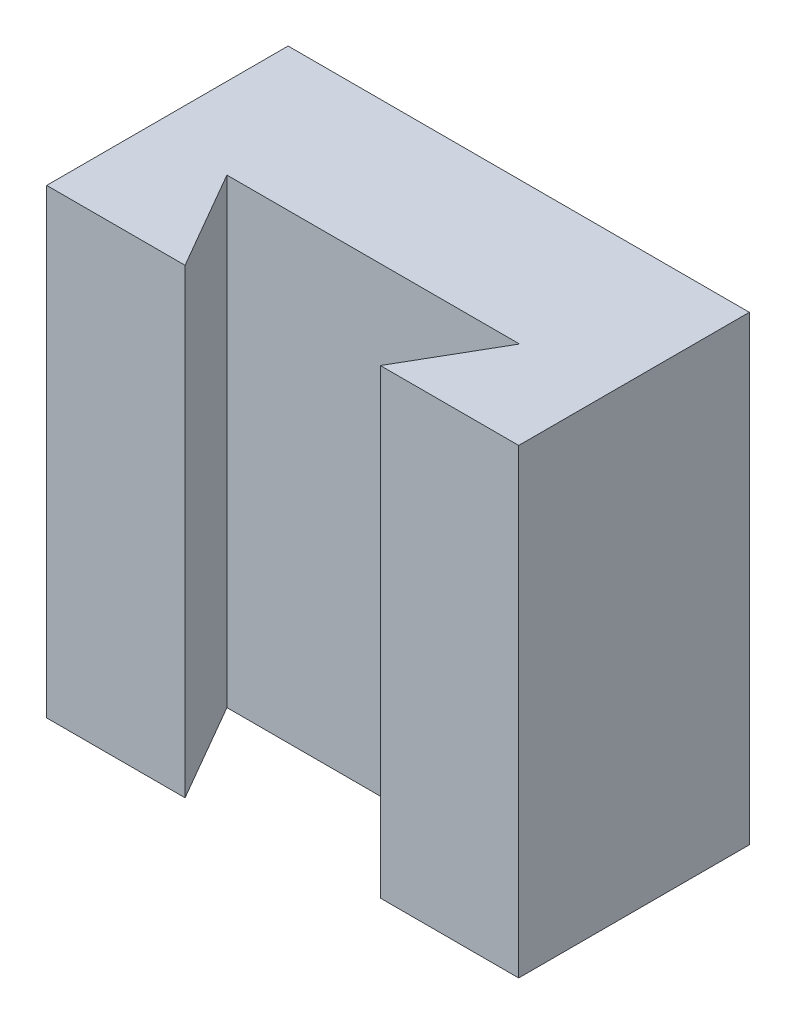
ISO-10303-21;
HEADER;
FILE_DESCRIPTION(('STEP AP214'),'2;1');
FILE_NAME('part.step','',(''),(''),'','','');
FILE_SCHEMA(('AUTOMOTIVE_DESIGN { 1 0 10303 214 1 1 1 1 }'));
ENDSEC;
DATA;
#1=APPLICATION_CONTEXT('core data for automotive mechanical design processes');
#2=APPLICATION_PROTOCOL_DEFINITION('international standard','automotive_design',2000,#1);
#3=PRODUCT_CONTEXT('',#1,'mechanical');
#4=PRODUCT('Part','Part','',(#3));
#5=PRODUCT_RELATED_PRODUCT_CATEGORY('part','',(#4));
#6=PRODUCT_DEFINITION_FORMATION('','',#4);
#7=PRODUCT_DEFINITION_CONTEXT('part definition',#1,'design');
#8=PRODUCT_DEFINITION('design','',#6,#7);
#9=PRODUCT_DEFINITION_SHAPE('','',#8);
#10=(LENGTH_UNIT() NAMED_UNIT(*) SI_UNIT(.MILLI.,.METRE.));
#11=(NAMED_UNIT(*) PLANE_ANGLE_UNIT() SI_UNIT($,.RADIAN.));
#12=(NAMED_UNIT(*) SI_UNIT($,.STERADIAN.) SOLID_ANGLE_UNIT());
#13=UNCERTAINTY_MEASURE_WITH_UNIT(LENGTH_MEASURE(1.E-05),#10,'distance_accuracy_value','');
#14=(GEOMETRIC_REPRESENTATION_CONTEXT(3) GLOBAL_UNCERTAINTY_ASSIGNED_CONTEXT((#13)) GLOBAL_UNIT_ASSIGNED_CONTEXT((#10,
#11,#12)) REPRESENTATION_CONTEXT('',''));
#15=CARTESIAN_POINT('',(0.,0.,0.));
#16=DIRECTION('',(0.,0.,1.));
#17=DIRECTION('',(1.,0.,0.));
#18=AXIS2_PLACEMENT_3D('',#15,#16,#17);
#19=CARTESIAN_POINT('',(-5.,-0.00999999999999959,0.234054964457145));
#20=DIRECTION('',(0.,0.,-1.));
#21=DIRECTION('',(-1.,0.,0.));
#22=AXIS2_PLACEMENT_3D('',#19,#20,#21);
#23=PLANE('',#22);
#24=DIRECTION('',(0.,1.,0.));
#25=VECTOR('',#24,1.);
#26=CARTESIAN_POINT('',(-2.,-0.00999999999999959,0.234054964457145));
#27=LINE('',#26,#25);
#28=CARTESIAN_POINT('',(-2.,0.,0.234054964457145));
#29=VERTEX_POINT('',#28);
#30=CARTESIAN_POINT('',(-2.,10.,0.234054964457145));
#31=VERTEX_POINT('',#30);
#32=EDGE_CURVE('E11',#29,#31,#27,.T.);
#33=ORIENTED_EDGE('',*,*,#32,.T.);
#34=DIRECTION('',(-1.,0.,0.));
#35=VECTOR('',#34,1.);
#36=CARTESIAN_POINT('',(0.,10.,0.234054964457145));
#37=LINE('',#36,#35);
#38=CARTESIAN_POINT('',(-5.,10.,0.234054964457145));
#39=VERTEX_POINT('',#38);
#40=EDGE_CURVE('E150',#31,#39,#37,.T.);
#41=ORIENTED_EDGE('',*,*,#40,.T.);
#42=DIRECTION('',(0.,1.,0.));
#43=VECTOR('',#42,1.);
#44=CARTESIAN_POINT('',(-5.,10.,0.234054964457145));
#45=LINE('',#44,#43);
#46=CARTESIAN_POINT('',(-5.,0.,0.234054964457145));
#47=VERTEX_POINT('',#46);
#48=EDGE_CURVE('E149',#47,#39,#45,.T.);
#49=ORIENTED_EDGE('',*,*,#48,.F.);
#50=DIRECTION('',(-1.,0.,0.));
#51=VECTOR('',#50,1.);
#52=CARTESIAN_POINT('',(0.,0.,0.234054964457145));
#53=LINE('',#52,#51);
#54=EDGE_CURVE('E57',#29,#47,#53,.T.);
#55=ORIENTED_EDGE('',*,*,#54,.F.);
#56=EDGE_LOOP('',(#33,#41,#49,#55));
#57=FACE_BOUND('',#56,.T.);
#58=ADVANCED_FACE('F43',(#57),#23,.F.);
#59=CARTESIAN_POINT('',(-2.,-0.00999999999999959,0.234054964457145));
#60=DIRECTION('',(-0.866025403784436,0.,0.500000000000004));
#61=DIRECTION('',(0.500000000000004,0.,0.866025403784436));
#62=AXIS2_PLACEMENT_3D('',#59,#60,#61);
#63=PLANE('',#62);
#64=DIRECTION('',(0.,1.,0.));
#65=VECTOR('',#64,1.);
#66=CARTESIAN_POINT('',(-3.2399584674678,-0.00999999999999959,-1.9136161004723));
#67=LINE('',#66,#65);
#68=CARTESIAN_POINT('',(-3.2399584674678,0.,-1.9136161004723));
#69=VERTEX_POINT('',#68);
#70=CARTESIAN_POINT('',(-3.2399584674678,10.,-1.9136161004723));
#71=VERTEX_POINT('',#70);
#72=EDGE_CURVE('E51',#69,#71,#67,.T.);
#73=ORIENTED_EDGE('',*,*,#72,.T.);
#74=DIRECTION('',(0.500000000000004,0.,0.866025403784436));
#75=VECTOR('',#74,1.);
#76=CARTESIAN_POINT('',(-1.60134877255087,10.,0.924539144898731));
#77=LINE('',#76,#75);
#78=EDGE_CURVE('E154',#71,#31,#77,.T.);
#79=ORIENTED_EDGE('',*,*,#78,.T.);
#80=ORIENTED_EDGE('',*,*,#32,.F.);
#81=DIRECTION('',(0.500000000000004,0.,0.866025403784436));
#82=VECTOR('',#81,1.);
#83=CARTESIAN_POINT('',(-1.60134877255087,0.,0.924539144898731));
#84=LINE('',#83,#82);
#85=EDGE_CURVE('E64',#69,#29,#84,.T.);
#86=ORIENTED_EDGE('',*,*,#85,.F.);
#87=EDGE_LOOP('',(#73,#79,#80,#86));
#88=FACE_BOUND('',#87,.T.);
#89=ADVANCED_FACE('F172',(#88),#63,.F.);
#90=CARTESIAN_POINT('',(-3.2399584674678,-0.00999999999999959,-1.9136161004723));
#91=DIRECTION('',(0.,0.,-1.));
#92=DIRECTION('',(-1.,0.,0.));
#93=AXIS2_PLACEMENT_3D('',#90,#91,#92);
#94=PLANE('',#93);
#95=DIRECTION('',(0.,1.,0.));
#96=VECTOR('',#95,1.);
#97=CARTESIAN_POINT('',(3.1048267707333,-0.00999999999999959,-1.9136161004723));
#98=LINE('',#97,#96);
#99=CARTESIAN_POINT('',(3.1048267707333,0.,-1.9136161004723));
#100=VERTEX_POINT('',#99);
#101=CARTESIAN_POINT('',(3.1048267707333,10.,-1.9136161004723));
#102=VERTEX_POINT('',#101);
#103=EDGE_CURVE('E169',#100,#102,#98,.T.);
#104=ORIENTED_EDGE('',*,*,#103,.T.);
#105=DIRECTION('',(-1.,0.,0.));
#106=VECTOR('',#105,1.);
#107=CARTESIAN_POINT('',(0.,10.,-1.9136161004723));
#108=LINE('',#107,#106);
#109=EDGE_CURVE('E157',#102,#71,#108,.T.);
#110=ORIENTED_EDGE('',*,*,#109,.T.);
#111=ORIENTED_EDGE('',*,*,#72,.F.);
#112=DIRECTION('',(-1.,0.,0.));
#113=VECTOR('',#112,1.);
#114=CARTESIAN_POINT('',(0.,0.,-1.9136161004723));
#115=LINE('',#114,#113);
#116=EDGE_CURVE('E141',#100,#69,#115,.T.);
#117=ORIENTED_EDGE('',*,*,#116,.F.);
#118=EDGE_LOOP('',(#104,#110,#111,#117));
#119=FACE_BOUND('',#118,.T.);
#120=ADVANCED_FACE('F174',(#119),#94,.F.);
#121=CARTESIAN_POINT('',(3.1048267707333,-0.00999999999999959,-1.9136161004723));
#122=DIRECTION('',(0.866025403784436,0.,0.500000000000004));
#123=DIRECTION('',(0.500000000000004,0.,-0.866025403784436));
#124=AXIS2_PLACEMENT_3D('',#121,#122,#123);
#125=PLANE('',#124);
#126=DIRECTION('',(0.,1.,0.));
#127=VECTOR('',#126,1.);
#128=CARTESIAN_POINT('',(2.,-0.00999999999999959,0.));
#129=LINE('',#128,#127);
#130=CARTESIAN_POINT('',(2.,0.,0.));
#131=VERTEX_POINT('',#130);
#132=CARTESIAN_POINT('',(2.,10.,0.));
#133=VERTEX_POINT('',#132);
#134=EDGE_CURVE('E153',#131,#133,#129,.T.);
#135=ORIENTED_EDGE('',*,*,#134,.T.);
#136=DIRECTION('',(0.500000000000004,0.,-0.866025403784436));
#137=VECTOR('',#136,1.);
#138=CARTESIAN_POINT('',(1.49999999999999,10.,0.866025403784443));
#139=LINE('',#138,#137);
#140=EDGE_CURVE('E160',#133,#102,#139,.T.);
#141=ORIENTED_EDGE('',*,*,#140,.T.);
#142=ORIENTED_EDGE('',*,*,#103,.F.);
#143=DIRECTION('',(0.500000000000004,0.,-0.866025403784436));
#144=VECTOR('',#143,1.);
#145=CARTESIAN_POINT('',(1.49999999999999,0.,0.866025403784443));
#146=LINE('',#145,#144);
#147=EDGE_CURVE('E143',#131,#100,#146,.T.);
#148=ORIENTED_EDGE('',*,*,#147,.F.);
#149=EDGE_LOOP('',(#135,#141,#142,#148));
#150=FACE_BOUND('',#149,.T.);
#151=ADVANCED_FACE('F187',(#150),#125,.F.);
#152=CARTESIAN_POINT('',(2.,-0.00999999999999959,0.));
#153=DIRECTION('',(0.,0.,-1.));
#154=DIRECTION('',(-1.,0.,0.));
#155=AXIS2_PLACEMENT_3D('',#152,#153,#154);
#156=PLANE('',#155);
#157=DIRECTION('',(0.,-1.,0.));
#158=VECTOR('',#157,1.);
#159=CARTESIAN_POINT('',(5.,10.,0.));
#160=LINE('',#159,#158);
#161=CARTESIAN_POINT('',(5.,10.,0.));
#162=VERTEX_POINT('',#161);
#163=CARTESIAN_POINT('',(5.,0.,0.));
#164=VERTEX_POINT('',#163);
#165=EDGE_CURVE('E164',#162,#164,#160,.T.);
#166=ORIENTED_EDGE('',*,*,#165,.F.);
#167=DIRECTION('',(-1.,0.,0.));
#168=VECTOR('',#167,1.);
#169=CARTESIAN_POINT('',(0.,10.,0.));
#170=LINE('',#169,#168);
#171=EDGE_CURVE('E115',#162,#133,#170,.T.);
#172=ORIENTED_EDGE('',*,*,#171,.T.);
#173=ORIENTED_EDGE('',*,*,#134,.F.);
#174=DIRECTION('',(-1.,0.,0.));
#175=VECTOR('',#174,1.);
#176=CARTESIAN_POINT('',(0.,0.,0.));
#177=LINE('',#176,#175);
#178=EDGE_CURVE('E146',#164,#131,#177,.T.);
#179=ORIENTED_EDGE('',*,*,#178,.F.);
#180=EDGE_LOOP('',(#166,#172,#173,#179));
#181=FACE_BOUND('',#180,.T.);
#182=ADVANCED_FACE('F45',(#181),#156,.F.);
#183=CARTESIAN_POINT('',(-5.,10.,-5.));
#184=DIRECTION('',(0.,0.,1.));
#185=DIRECTION('',(1.,0.,0.));
#186=AXIS2_PLACEMENT_3D('',#183,#184,#185);
#187=PLANE('',#186);
#188=DIRECTION('',(-1.,0.,0.));
#189=VECTOR('',#188,1.);
#190=CARTESIAN_POINT('',(-5.,0.,-5.));
#191=LINE('',#190,#189);
#192=CARTESIAN_POINT('',(5.,0.,-5.));
#193=VERTEX_POINT('',#192);
#194=CARTESIAN_POINT('',(-5.,0.,-5.));
#195=VERTEX_POINT('',#194);
#196=EDGE_CURVE('E198',#193,#195,#191,.T.);
#197=ORIENTED_EDGE('',*,*,#196,.T.);
#198=DIRECTION('',(0.,-1.,0.));
#199=VECTOR('',#198,1.);
#200=CARTESIAN_POINT('',(-5.,10.,-5.));
#201=LINE('',#200,#199);
#202=CARTESIAN_POINT('',(-5.,10.,-5.));
#203=VERTEX_POINT('',#202);
#204=EDGE_CURVE('E127',#203,#195,#201,.T.);
#205=ORIENTED_EDGE('',*,*,#204,.F.);
#206=DIRECTION('',(-1.,0.,0.));
#207=VECTOR('',#206,1.);
#208=CARTESIAN_POINT('',(-5.,10.,-5.));
#209=LINE('',#208,#207);
#210=CARTESIAN_POINT('',(5.,10.,-5.));
#211=VERTEX_POINT('',#210);
#212=EDGE_CURVE('E112',#211,#203,#209,.T.);
#213=ORIENTED_EDGE('',*,*,#212,.F.);
#214=DIRECTION('',(0.,-1.,0.));
#215=VECTOR('',#214,1.);
#216=CARTESIAN_POINT('',(5.,10.,-5.));
#217=LINE('',#216,#215);
#218=EDGE_CURVE('E125',#211,#193,#217,.T.);
#219=ORIENTED_EDGE('',*,*,#218,.T.);
#220=EDGE_LOOP('',(#197,#205,#213,#219));
#221=FACE_BOUND('',#220,.T.);
#222=ADVANCED_FACE('F124',(#221),#187,.F.);
#223=CARTESIAN_POINT('',(-5.,10.,-5.));
#224=DIRECTION('',(1.,0.,0.));
#225=DIRECTION('',(0.,0.,-1.));
#226=AXIS2_PLACEMENT_3D('',#223,#224,#225);
#227=PLANE('',#226);
#228=DIRECTION('',(0.,0.,1.));
#229=VECTOR('',#228,1.);
#230=CARTESIAN_POINT('',(-5.,0.,-5.));
#231=LINE('',#230,#229);
#232=EDGE_CURVE('E120',#195,#47,#231,.T.);
#233=ORIENTED_EDGE('',*,*,#232,.T.);
#234=ORIENTED_EDGE('',*,*,#48,.T.);
#235=DIRECTION('',(0.,0.,1.));
#236=VECTOR('',#235,1.);
#237=CARTESIAN_POINT('',(-5.,10.,-5.));
#238=LINE('',#237,#236);
#239=EDGE_CURVE('E129',#203,#39,#238,.T.);
#240=ORIENTED_EDGE('',*,*,#239,.F.);
#241=ORIENTED_EDGE('',*,*,#204,.T.);
#242=EDGE_LOOP('',(#233,#234,#240,#241));
#243=FACE_BOUND('',#242,.T.);
#244=ADVANCED_FACE('F204',(#243),#227,.F.);
#245=CARTESIAN_POINT('',(5.,10.,-5.));
#246=DIRECTION('',(-1.,0.,0.));
#247=DIRECTION('',(0.,0.,1.));
#248=AXIS2_PLACEMENT_3D('',#245,#246,#247);
#249=PLANE('',#248);
#250=DIRECTION('',(0.,0.,-1.));
#251=VECTOR('',#250,1.);
#252=CARTESIAN_POINT('',(5.,10.,-5.));
#253=LINE('',#252,#251);
#254=EDGE_CURVE('E108',#162,#211,#253,.T.);
#255=ORIENTED_EDGE('',*,*,#254,.F.);
#256=ORIENTED_EDGE('',*,*,#165,.T.);
#257=DIRECTION('',(0.,0.,-1.));
#258=VECTOR('',#257,1.);
#259=CARTESIAN_POINT('',(5.,0.,-5.));
#260=LINE('',#259,#258);
#261=EDGE_CURVE('E133',#164,#193,#260,.T.);
#262=ORIENTED_EDGE('',*,*,#261,.T.);
#263=ORIENTED_EDGE('',*,*,#218,.F.);
#264=EDGE_LOOP('',(#255,#256,#262,#263));
#265=FACE_BOUND('',#264,.T.);
#266=ADVANCED_FACE('F131',(#265),#249,.F.);
#267=CARTESIAN_POINT('',(0.,0.,0.));
#268=DIRECTION('',(0.,1.,0.));
#269=DIRECTION('',(0.,0.,1.));
#270=AXIS2_PLACEMENT_3D('',#267,#268,#269);
#271=PLANE('',#270);
#272=ORIENTED_EDGE('',*,*,#261,.F.);
#273=ORIENTED_EDGE('',*,*,#178,.T.);
#274=ORIENTED_EDGE('',*,*,#147,.T.);
#275=ORIENTED_EDGE('',*,*,#116,.T.);
#276=ORIENTED_EDGE('',*,*,#85,.T.);
#277=ORIENTED_EDGE('',*,*,#54,.T.);
#278=ORIENTED_EDGE('',*,*,#232,.F.);
#279=ORIENTED_EDGE('',*,*,#196,.F.);
#280=EDGE_LOOP('',(#272,#273,#274,#275,#276,#277,#278,#279));
#281=FACE_BOUND('',#280,.T.);
#282=ADVANCED_FACE('F196',(#281),#271,.F.);
#283=CARTESIAN_POINT('',(0.,10.,0.));
#284=DIRECTION('',(0.,1.,0.));
#285=DIRECTION('',(0.,0.,1.));
#286=AXIS2_PLACEMENT_3D('',#283,#284,#285);
#287=PLANE('',#286);
#288=ORIENTED_EDGE('',*,*,#171,.F.);
#289=ORIENTED_EDGE('',*,*,#254,.T.);
#290=ORIENTED_EDGE('',*,*,#212,.T.);
#291=ORIENTED_EDGE('',*,*,#239,.T.);
#292=ORIENTED_EDGE('',*,*,#40,.F.);
#293=ORIENTED_EDGE('',*,*,#78,.F.);
#294=ORIENTED_EDGE('',*,*,#109,.F.);
#295=ORIENTED_EDGE('',*,*,#140,.F.);
#296=EDGE_LOOP('',(#288,#289,#290,#291,#292,#293,#294,#295));
#297=FACE_BOUND('',#296,.T.);
#298=ADVANCED_FACE('F110',(#297),#287,.T.);
#299=CLOSED_SHELL('',(#58,#89,#120,#151,#182,#222,#244,#266,#282,#298));
#300=MANIFOLD_SOLID_BREP('B2',#299);
#301=ADVANCED_BREP_SHAPE_REPRESENTATION('',(#18,#300),#14);
#302=SHAPE_DEFINITION_REPRESENTATION(#9,#301);
ENDSEC;
END-ISO-10303-21;
